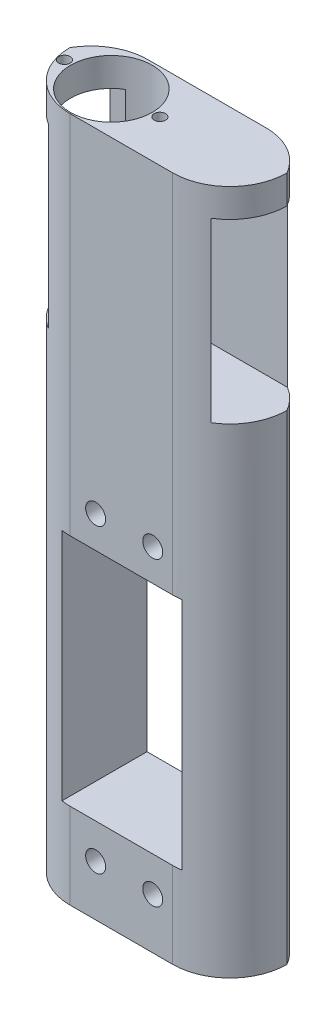
ISO-10303-21;
HEADER;
FILE_DESCRIPTION(('STEP AP214'),'2;1');
FILE_NAME('part.step','',(''),(''),'','','');
FILE_SCHEMA(('AUTOMOTIVE_DESIGN { 1 0 10303 214 1 1 1 1 }'));
ENDSEC;
DATA;
#1=APPLICATION_CONTEXT('core data for automotive mechanical design processes');
#2=APPLICATION_PROTOCOL_DEFINITION('international standard','automotive_design',2000,#1);
#3=PRODUCT_CONTEXT('',#1,'mechanical');
#4=PRODUCT('Part','Part','',(#3));
#5=PRODUCT_RELATED_PRODUCT_CATEGORY('part','',(#4));
#6=PRODUCT_DEFINITION_FORMATION('','',#4);
#7=PRODUCT_DEFINITION_CONTEXT('part definition',#1,'design');
#8=PRODUCT_DEFINITION('design','',#6,#7);
#9=PRODUCT_DEFINITION_SHAPE('','',#8);
#10=(LENGTH_UNIT() NAMED_UNIT(*) SI_UNIT(.MILLI.,.METRE.));
#11=(NAMED_UNIT(*) PLANE_ANGLE_UNIT() SI_UNIT($,.RADIAN.));
#12=(NAMED_UNIT(*) SI_UNIT($,.STERADIAN.) SOLID_ANGLE_UNIT());
#13=UNCERTAINTY_MEASURE_WITH_UNIT(LENGTH_MEASURE(1.E-05),#10,'distance_accuracy_value','');
#14=(GEOMETRIC_REPRESENTATION_CONTEXT(3) GLOBAL_UNCERTAINTY_ASSIGNED_CONTEXT((#13)) GLOBAL_UNIT_ASSIGNED_CONTEXT((#10,
#11,#12)) REPRESENTATION_CONTEXT('',''));
#15=CARTESIAN_POINT('',(0.,0.,0.));
#16=DIRECTION('',(0.,0.,1.));
#17=DIRECTION('',(1.,0.,0.));
#18=AXIS2_PLACEMENT_3D('',#15,#16,#17);
#19=CARTESIAN_POINT('',(0.,0.,0.));
#20=DIRECTION('',(0.,0.,1.));
#21=DIRECTION('',(1.,0.,0.));
#22=AXIS2_PLACEMENT_3D('',#19,#20,#21);
#23=PLANE('',#22);
#24=CARTESIAN_POINT('',(-6.24380165289257,-9.51763056496016,0.));
#25=DIRECTION('',(0.,0.,1.));
#26=DIRECTION('',(1.,0.,0.));
#27=AXIS2_PLACEMENT_3D('',#24,#25,#26);
#28=CIRCLE('',#27,1.75);
#29=CARTESIAN_POINT('',(-4.49380165289257,-9.51763056496016,0.));
#30=VERTEX_POINT('',#29);
#31=EDGE_CURVE('E262',#30,#30,#28,.T.);
#32=ORIENTED_EDGE('',*,*,#31,.T.);
#33=EDGE_LOOP('',(#32));
#34=FACE_BOUND('',#33,.T.);
#35=CARTESIAN_POINT('',(3.75619834710743,-9.51763056496016,0.));
#36=DIRECTION('',(0.,0.,1.));
#37=DIRECTION('',(1.,0.,0.));
#38=AXIS2_PLACEMENT_3D('',#35,#36,#37);
#39=CIRCLE('',#38,1.75);
#40=CARTESIAN_POINT('',(5.50619834710743,-9.51763056496016,0.));
#41=VERTEX_POINT('',#40);
#42=EDGE_CURVE('E254',#41,#41,#39,.T.);
#43=ORIENTED_EDGE('',*,*,#42,.T.);
#44=EDGE_LOOP('',(#43));
#45=FACE_BOUND('',#44,.T.);
#46=DIRECTION('',(-1.,0.,0.));
#47=VECTOR('',#46,1.);
#48=CARTESIAN_POINT('',(-20.7438016528926,48.8925619834711,0.));
#49=LINE('',#48,#47);
#50=CARTESIAN_POINT('',(8.59594430926305,48.8925619834711,0.));
#51=VERTEX_POINT('',#50);
#52=CARTESIAN_POINT('',(-12.0835476150482,48.8925619834711,0.));
#53=VERTEX_POINT('',#52);
#54=EDGE_CURVE('E292',#51,#53,#49,.T.);
#55=ORIENTED_EDGE('',*,*,#54,.F.);
#56=DIRECTION('',(0.,1.,0.));
#57=VECTOR('',#56,1.);
#58=CARTESIAN_POINT('',(8.59594430926305,0.,0.));
#59=LINE('',#58,#57);
#60=CARTESIAN_POINT('',(8.59594430926305,-15.1074380165289,0.));
#61=VERTEX_POINT('',#60);
#62=EDGE_CURVE('E381',#51,#61,#59,.F.);
#63=ORIENTED_EDGE('',*,*,#62,.T.);
#64=DIRECTION('',(1.,0.,0.));
#65=VECTOR('',#64,1.);
#66=CARTESIAN_POINT('',(-12.2438016528926,-15.1074380165289,0.));
#67=LINE('',#66,#65);
#68=CARTESIAN_POINT('',(-12.0835476150482,-15.1074380165289,0.));
#69=VERTEX_POINT('',#68);
#70=EDGE_CURVE('E271',#69,#61,#67,.T.);
#71=ORIENTED_EDGE('',*,*,#70,.F.);
#72=DIRECTION('',(0.,-1.,0.));
#73=VECTOR('',#72,1.);
#74=CARTESIAN_POINT('',(-12.0835476150482,0.,0.));
#75=LINE('',#74,#73);
#76=EDGE_CURVE('E375',#69,#53,#75,.F.);
#77=ORIENTED_EDGE('',*,*,#76,.T.);
#78=EDGE_LOOP('',(#55,#63,#71,#77));
#79=FACE_BOUND('',#78,.T.);
#80=ADVANCED_FACE('F41',(#34,#45,#79),#23,.F.);
#81=CARTESIAN_POINT('',(0.,0.,15.));
#82=DIRECTION('',(0.,0.,1.));
#83=DIRECTION('',(1.,0.,0.));
#84=AXIS2_PLACEMENT_3D('',#81,#82,#83);
#85=PLANE('',#84);
#86=CARTESIAN_POINT('',(3.75619834710744,-62.2155638806435,15.));
#87=DIRECTION('',(0.,0.,1.));
#88=DIRECTION('',(1.,0.,0.));
#89=AXIS2_PLACEMENT_3D('',#86,#87,#88);
#90=CIRCLE('',#89,1.75);
#91=CARTESIAN_POINT('',(5.50619834710744,-62.2155638806435,15.));
#92=VERTEX_POINT('',#91);
#93=EDGE_CURVE('E244',#92,#92,#90,.T.);
#94=ORIENTED_EDGE('',*,*,#93,.F.);
#95=EDGE_LOOP('',(#94));
#96=FACE_BOUND('',#95,.T.);
#97=CARTESIAN_POINT('',(-6.24380165289257,-62.2155638806435,15.));
#98=DIRECTION('',(0.,0.,1.));
#99=DIRECTION('',(1.,0.,0.));
#100=AXIS2_PLACEMENT_3D('',#97,#98,#99);
#101=CIRCLE('',#100,1.75);
#102=CARTESIAN_POINT('',(-4.49380165289256,-62.2155638806435,15.));
#103=VERTEX_POINT('',#102);
#104=EDGE_CURVE('E257',#103,#103,#101,.T.);
#105=ORIENTED_EDGE('',*,*,#104,.F.);
#106=EDGE_LOOP('',(#105));
#107=FACE_BOUND('',#106,.T.);
#108=DIRECTION('',(1.,0.,0.));
#109=VECTOR('',#108,1.);
#110=CARTESIAN_POINT('',(-20.7438016528926,-71.1074380165289,15.));
#111=LINE('',#110,#109);
#112=CARTESIAN_POINT('',(-10.7438016528926,-71.1074380165289,15.));
#113=VERTEX_POINT('',#112);
#114=CARTESIAN_POINT('',(7.25619834710745,-71.1074380165289,15.));
#115=VERTEX_POINT('',#114);
#116=EDGE_CURVE('E288',#113,#115,#111,.T.);
#117=ORIENTED_EDGE('',*,*,#116,.T.);
#118=DIRECTION('',(0.,1.,0.));
#119=VECTOR('',#118,1.);
#120=CARTESIAN_POINT('',(7.25619834710743,48.8925619834711,15.));
#121=LINE('',#120,#119);
#122=CARTESIAN_POINT('',(7.25619834710744,-56.1074380165289,15.));
#123=VERTEX_POINT('',#122);
#124=EDGE_CURVE('E318',#115,#123,#121,.T.);
#125=ORIENTED_EDGE('',*,*,#124,.T.);
#126=DIRECTION('',(1.,0.,0.));
#127=VECTOR('',#126,1.);
#128=CARTESIAN_POINT('',(-12.2438016528926,-56.1074380165289,15.));
#129=LINE('',#128,#127);
#130=CARTESIAN_POINT('',(-10.7438016528926,-56.1074380165289,15.));
#131=VERTEX_POINT('',#130);
#132=EDGE_CURVE('E265',#131,#123,#129,.T.);
#133=ORIENTED_EDGE('',*,*,#132,.F.);
#134=DIRECTION('',(0.,-1.,0.));
#135=VECTOR('',#134,1.);
#136=CARTESIAN_POINT('',(-10.7438016528926,-71.1074380165289,15.));
#137=LINE('',#136,#135);
#138=EDGE_CURVE('E307',#131,#113,#137,.T.);
#139=ORIENTED_EDGE('',*,*,#138,.T.);
#140=EDGE_LOOP('',(#117,#125,#133,#139));
#141=FACE_BOUND('',#140,.T.);
#142=ADVANCED_FACE('F460',(#96,#107,#141),#85,.T.);
#143=CARTESIAN_POINT('',(-20.7438016528926,43.8925619834711,13.5312912499812));
#144=DIRECTION('',(0.,1.,0.));
#145=DIRECTION('',(-1.,0.,0.));
#146=AXIS2_PLACEMENT_3D('',#143,#144,#145);
#147=PLANE('',#146);
#148=CARTESIAN_POINT('',(-2.36469917471287,43.8925619834711,7.62880946549471));
#149=DIRECTION('',(0.,1.,0.));
#150=DIRECTION('',(-1.,0.,0.));
#151=AXIS2_PLACEMENT_3D('',#148,#149,#150);
#152=CIRCLE('',#151,0.999999999999997);
#153=CARTESIAN_POINT('',(-3.36469917471287,43.8925619834711,7.62880946549471));
#154=VERTEX_POINT('',#153);
#155=EDGE_CURVE('E243',#154,#154,#152,.T.);
#156=ORIENTED_EDGE('',*,*,#155,.T.);
#157=EDGE_LOOP('',(#156));
#158=FACE_BOUND('',#157,.T.);
#159=DIRECTION('',(1.,0.,0.));
#160=VECTOR('',#159,1.);
#161=CARTESIAN_POINT('',(-20.7438016528926,43.8925619834711,1.46870875001881));
#162=LINE('',#161,#160);
#163=CARTESIAN_POINT('',(-7.22396094970001,43.8925619834711,1.4687087500188));
#164=VERTEX_POINT('',#163);
#165=CARTESIAN_POINT('',(13.8129424507228,43.8925619834711,1.46870875001881));
#166=VERTEX_POINT('',#165);
#167=EDGE_CURVE('E237',#164,#166,#162,.T.);
#168=ORIENTED_EDGE('',*,*,#167,.T.);
#169=CARTESIAN_POINT('',(8.59594430926305,43.8925619834711,10.));
#170=DIRECTION('',(0.,1.,0.));
#171=DIRECTION('',(-1.,0.,0.));
#172=AXIS2_PLACEMENT_3D('',#169,#170,#171);
#173=CIRCLE('',#172,10.);
#174=CARTESIAN_POINT('',(17.2561983471074,43.8925619834711,5.));
#175=VERTEX_POINT('',#174);
#176=EDGE_CURVE('E404',#166,#175,#173,.F.);
#177=ORIENTED_EDGE('',*,*,#176,.T.);
#178=CARTESIAN_POINT('',(7.25619834710743,43.8925619834711,5.));
#179=DIRECTION('',(0.,1.,0.));
#180=DIRECTION('',(-1.,0.,0.));
#181=AXIS2_PLACEMENT_3D('',#178,#179,#180);
#182=CIRCLE('',#181,10.);
#183=CARTESIAN_POINT('',(12.4731964885672,43.8925619834711,13.5312912499812));
#184=VERTEX_POINT('',#183);
#185=EDGE_CURVE('E345',#175,#184,#182,.F.);
#186=ORIENTED_EDGE('',*,*,#185,.T.);
#187=DIRECTION('',(1.,0.,0.));
#188=VECTOR('',#187,1.);
#189=CARTESIAN_POINT('',(-20.7438016528926,43.8925619834711,13.5312912499812));
#190=LINE('',#189,#188);
#191=CARTESIAN_POINT('',(-6.81963744073625,43.8925619834711,13.5312912499812));
#192=VERTEX_POINT('',#191);
#193=EDGE_CURVE('E234',#192,#184,#190,.T.);
#194=ORIENTED_EDGE('',*,*,#193,.F.);
#195=CARTESIAN_POINT('',(-10.8646991747129,43.8925619834711,7.62880946549471));
#196=DIRECTION('',(0.,1.,0.));
#197=DIRECTION('',(-1.,0.,0.));
#198=AXIS2_PLACEMENT_3D('',#195,#196,#197);
#199=CIRCLE('',#198,7.15554439912691);
#200=EDGE_CURVE('E210',#192,#164,#199,.T.);
#201=ORIENTED_EDGE('',*,*,#200,.T.);
#202=EDGE_LOOP('',(#168,#177,#186,#194,#201));
#203=FACE_BOUND('',#202,.T.);
#204=ADVANCED_FACE('F490',(#158,#203),#147,.F.);
#205=CARTESIAN_POINT('',(-20.7438016528926,-71.1074380165289,15.));
#206=DIRECTION('',(0.,1.,0.));
#207=DIRECTION('',(-1.,0.,0.));
#208=AXIS2_PLACEMENT_3D('',#205,#206,#207);
#209=PLANE('',#208);
#210=DIRECTION('',(1.,0.,0.));
#211=VECTOR('',#210,1.);
#212=CARTESIAN_POINT('',(-20.7438016528926,-71.1074380165289,0.));
#213=LINE('',#212,#211);
#214=CARTESIAN_POINT('',(-12.0835476150482,-71.1074380165289,0.));
#215=VERTEX_POINT('',#214);
#216=CARTESIAN_POINT('',(8.59594430926306,-71.1074380165289,0.));
#217=VERTEX_POINT('',#216);
#218=EDGE_CURVE('E282',#215,#217,#213,.T.);
#219=ORIENTED_EDGE('',*,*,#218,.T.);
#220=CARTESIAN_POINT('',(8.59594430926306,-71.1074380165289,10.));
#221=DIRECTION('',(0.,1.,0.));
#222=DIRECTION('',(-1.,0.,0.));
#223=AXIS2_PLACEMENT_3D('',#220,#221,#222);
#224=CIRCLE('',#223,10.);
#225=CARTESIAN_POINT('',(17.2561983471074,-71.1074380165289,5.));
#226=VERTEX_POINT('',#225);
#227=EDGE_CURVE('E395',#217,#226,#224,.F.);
#228=ORIENTED_EDGE('',*,*,#227,.T.);
#229=CARTESIAN_POINT('',(7.25619834710745,-71.1074380165289,5.));
#230=DIRECTION('',(0.,1.,0.));
#231=DIRECTION('',(-1.,0.,0.));
#232=AXIS2_PLACEMENT_3D('',#229,#230,#231);
#233=CIRCLE('',#232,10.);
#234=EDGE_CURVE('E358',#226,#115,#233,.F.);
#235=ORIENTED_EDGE('',*,*,#234,.T.);
#236=ORIENTED_EDGE('',*,*,#116,.F.);
#237=CARTESIAN_POINT('',(-10.7438016528926,-71.1074380165289,5.));
#238=DIRECTION('',(0.,1.,0.));
#239=DIRECTION('',(-1.,0.,0.));
#240=AXIS2_PLACEMENT_3D('',#237,#238,#239);
#241=CIRCLE('',#240,10.);
#242=CARTESIAN_POINT('',(-20.7438016528926,-71.1074380165289,5.));
#243=VERTEX_POINT('',#242);
#244=EDGE_CURVE('E355',#113,#243,#241,.F.);
#245=ORIENTED_EDGE('',*,*,#244,.T.);
#246=CARTESIAN_POINT('',(-12.0835476150482,-71.1074380165289,10.));
#247=DIRECTION('',(0.,1.,0.));
#248=DIRECTION('',(-1.,0.,0.));
#249=AXIS2_PLACEMENT_3D('',#246,#247,#248);
#250=CIRCLE('',#249,10.);
#251=EDGE_CURVE('E393',#243,#215,#250,.F.);
#252=ORIENTED_EDGE('',*,*,#251,.T.);
#253=EDGE_LOOP('',(#219,#228,#235,#236,#245,#252));
#254=FACE_BOUND('',#253,.T.);
#255=ADVANCED_FACE('F463',(#254),#209,.F.);
#256=CARTESIAN_POINT('',(-20.7438016528926,48.8925619834711,15.));
#257=DIRECTION('',(0.,-1.,0.));
#258=DIRECTION('',(0.,0.,-1.));
#259=AXIS2_PLACEMENT_3D('',#256,#257,#258);
#260=PLANE('',#259);
#261=CARTESIAN_POINT('',(-2.36469917471287,48.8925619834711,7.62880946549471));
#262=DIRECTION('',(0.,1.,0.));
#263=DIRECTION('',(0.,0.,1.));
#264=AXIS2_PLACEMENT_3D('',#261,#262,#263);
#265=CIRCLE('',#264,0.999999999999997);
#266=CARTESIAN_POINT('',(-2.36469917471287,48.8925619834711,8.6288094654947));
#267=VERTEX_POINT('',#266);
#268=EDGE_CURVE('E803',#267,#267,#265,.T.);
#269=ORIENTED_EDGE('',*,*,#268,.F.);
#270=EDGE_LOOP('',(#269));
#271=FACE_BOUND('',#270,.T.);
#272=CARTESIAN_POINT('',(-19.3646991747129,48.8925619834711,7.34037533265232));
#273=DIRECTION('',(0.,1.,0.));
#274=DIRECTION('',(0.,0.,1.));
#275=AXIS2_PLACEMENT_3D('',#272,#273,#274);
#276=CIRCLE('',#275,0.999999999999998);
#277=CARTESIAN_POINT('',(-19.3646991747129,48.8925619834711,8.34037533265232));
#278=VERTEX_POINT('',#277);
#279=EDGE_CURVE('E801',#278,#278,#276,.T.);
#280=ORIENTED_EDGE('',*,*,#279,.F.);
#281=EDGE_LOOP('',(#280));
#282=FACE_BOUND('',#281,.T.);
#283=CARTESIAN_POINT('',(-10.8646991747129,48.8925619834711,7.62880946549471));
#284=DIRECTION('',(0.,1.,0.));
#285=DIRECTION('',(0.,0.,1.));
#286=AXIS2_PLACEMENT_3D('',#283,#284,#285);
#287=CIRCLE('',#286,7.15554439912691);
#288=CARTESIAN_POINT('',(-10.8646991747129,48.8925619834711,14.7843538646216));
#289=VERTEX_POINT('',#288);
#290=EDGE_CURVE('E221',#289,#289,#287,.T.);
#291=ORIENTED_EDGE('',*,*,#290,.F.);
#292=EDGE_LOOP('',(#291));
#293=FACE_BOUND('',#292,.T.);
#294=CARTESIAN_POINT('',(7.25619834710743,48.8925619834711,5.));
#295=DIRECTION('',(0.,-1.,0.));
#296=DIRECTION('',(0.,0.,-1.));
#297=AXIS2_PLACEMENT_3D('',#294,#295,#296);
#298=CIRCLE('',#297,10.);
#299=CARTESIAN_POINT('',(7.25619834710743,48.8925619834711,15.));
#300=VERTEX_POINT('',#299);
#301=CARTESIAN_POINT('',(17.2561983471074,48.8925619834711,5.));
#302=VERTEX_POINT('',#301);
#303=EDGE_CURVE('E336',#300,#302,#298,.F.);
#304=ORIENTED_EDGE('',*,*,#303,.T.);
#305=CARTESIAN_POINT('',(8.59594430926305,48.8925619834711,10.));
#306=DIRECTION('',(0.,-1.,0.));
#307=DIRECTION('',(0.,0.,-1.));
#308=AXIS2_PLACEMENT_3D('',#305,#306,#307);
#309=CIRCLE('',#308,10.);
#310=EDGE_CURVE('E373',#302,#51,#309,.F.);
#311=ORIENTED_EDGE('',*,*,#310,.T.);
#312=ORIENTED_EDGE('',*,*,#54,.T.);
#313=CARTESIAN_POINT('',(-12.0835476150482,48.8925619834711,10.));
#314=DIRECTION('',(0.,-1.,0.));
#315=DIRECTION('',(0.,0.,-1.));
#316=AXIS2_PLACEMENT_3D('',#313,#314,#315);
#317=CIRCLE('',#316,10.);
#318=CARTESIAN_POINT('',(-20.7438016528926,48.8925619834711,5.));
#319=VERTEX_POINT('',#318);
#320=EDGE_CURVE('E371',#53,#319,#317,.F.);
#321=ORIENTED_EDGE('',*,*,#320,.T.);
#322=CARTESIAN_POINT('',(-10.7438016528926,48.8925619834711,5.));
#323=DIRECTION('',(0.,-1.,0.));
#324=DIRECTION('',(0.,0.,-1.));
#325=AXIS2_PLACEMENT_3D('',#322,#323,#324);
#326=CIRCLE('',#325,10.);
#327=CARTESIAN_POINT('',(-10.7438016528926,48.8925619834711,15.));
#328=VERTEX_POINT('',#327);
#329=EDGE_CURVE('E334',#319,#328,#326,.F.);
#330=ORIENTED_EDGE('',*,*,#329,.T.);
#331=DIRECTION('',(-1.,0.,0.));
#332=VECTOR('',#331,1.);
#333=CARTESIAN_POINT('',(-20.7438016528926,48.8925619834711,15.));
#334=LINE('',#333,#332);
#335=EDGE_CURVE('E291',#300,#328,#334,.T.);
#336=ORIENTED_EDGE('',*,*,#335,.F.);
#337=EDGE_LOOP('',(#304,#311,#312,#321,#330,#336));
#338=FACE_BOUND('',#337,.T.);
#339=ADVANCED_FACE('F424',(#271,#282,#293,#338),#260,.F.);
#340=CARTESIAN_POINT('',(3.75619834710743,-9.51763056496016,15.));
#341=DIRECTION('',(0.,0.,1.));
#342=DIRECTION('',(1.,0.,0.));
#343=AXIS2_PLACEMENT_3D('',#340,#341,#342);
#344=CIRCLE('',#343,1.75);
#345=CARTESIAN_POINT('',(5.50619834710743,-9.51763056496016,15.));
#346=VERTEX_POINT('',#345);
#347=EDGE_CURVE('E250',#346,#346,#344,.T.);
#348=ORIENTED_EDGE('',*,*,#347,.F.);
#349=EDGE_LOOP('',(#348));
#350=FACE_BOUND('',#349,.T.);
#351=CARTESIAN_POINT('',(-6.24380165289257,-9.51763056496016,15.));
#352=DIRECTION('',(0.,0.,1.));
#353=DIRECTION('',(1.,0.,0.));
#354=AXIS2_PLACEMENT_3D('',#351,#352,#353);
#355=CIRCLE('',#354,1.75);
#356=CARTESIAN_POINT('',(-4.49380165289257,-9.51763056496016,15.));
#357=VERTEX_POINT('',#356);
#358=EDGE_CURVE('E253',#357,#357,#355,.T.);
#359=ORIENTED_EDGE('',*,*,#358,.F.);
#360=EDGE_LOOP('',(#359));
#361=FACE_BOUND('',#360,.T.);
#362=DIRECTION('',(1.,0.,0.));
#363=VECTOR('',#362,1.);
#364=CARTESIAN_POINT('',(-12.2438016528926,-15.1074380165289,15.));
#365=LINE('',#364,#363);
#366=CARTESIAN_POINT('',(-10.7438016528926,-15.1074380165289,15.));
#367=VERTEX_POINT('',#366);
#368=CARTESIAN_POINT('',(7.25619834710744,-15.1074380165289,15.));
#369=VERTEX_POINT('',#368);
#370=EDGE_CURVE('E272',#367,#369,#365,.T.);
#371=ORIENTED_EDGE('',*,*,#370,.T.);
#372=DIRECTION('',(0.,1.,0.));
#373=VECTOR('',#372,1.);
#374=CARTESIAN_POINT('',(7.25619834710743,48.8925619834711,15.));
#375=LINE('',#374,#373);
#376=EDGE_CURVE('E316',#369,#300,#375,.T.);
#377=ORIENTED_EDGE('',*,*,#376,.T.);
#378=ORIENTED_EDGE('',*,*,#335,.T.);
#379=DIRECTION('',(0.,-1.,0.));
#380=VECTOR('',#379,1.);
#381=CARTESIAN_POINT('',(-10.7438016528926,-71.1074380165289,15.));
#382=LINE('',#381,#380);
#383=EDGE_CURVE('E313',#328,#367,#382,.T.);
#384=ORIENTED_EDGE('',*,*,#383,.T.);
#385=EDGE_LOOP('',(#371,#377,#378,#384));
#386=FACE_BOUND('',#385,.T.);
#387=ADVANCED_FACE('F494',(#350,#361,#386),#85,.T.);
#388=CARTESIAN_POINT('',(-6.24380165289257,-62.2155638806435,0.));
#389=DIRECTION('',(0.,0.,1.));
#390=DIRECTION('',(1.,0.,0.));
#391=AXIS2_PLACEMENT_3D('',#388,#389,#390);
#392=CIRCLE('',#391,1.75);
#393=CARTESIAN_POINT('',(-4.49380165289256,-62.2155638806435,0.));
#394=VERTEX_POINT('',#393);
#395=EDGE_CURVE('E247',#394,#394,#392,.T.);
#396=ORIENTED_EDGE('',*,*,#395,.T.);
#397=EDGE_LOOP('',(#396));
#398=FACE_BOUND('',#397,.T.);
#399=CARTESIAN_POINT('',(3.75619834710744,-62.2155638806435,0.));
#400=DIRECTION('',(0.,0.,1.));
#401=DIRECTION('',(1.,0.,0.));
#402=AXIS2_PLACEMENT_3D('',#399,#400,#401);
#403=CIRCLE('',#402,1.75);
#404=CARTESIAN_POINT('',(5.50619834710744,-62.2155638806435,0.));
#405=VERTEX_POINT('',#404);
#406=EDGE_CURVE('E233',#405,#405,#403,.T.);
#407=ORIENTED_EDGE('',*,*,#406,.T.);
#408=EDGE_LOOP('',(#407));
#409=FACE_BOUND('',#408,.T.);
#410=DIRECTION('',(1.,0.,0.));
#411=VECTOR('',#410,1.);
#412=CARTESIAN_POINT('',(-12.2438016528926,-56.1074380165289,0.));
#413=LINE('',#412,#411);
#414=CARTESIAN_POINT('',(-12.0835476150482,-56.1074380165289,0.));
#415=VERTEX_POINT('',#414);
#416=CARTESIAN_POINT('',(8.59594430926305,-56.1074380165289,0.));
#417=VERTEX_POINT('',#416);
#418=EDGE_CURVE('E268',#415,#417,#413,.T.);
#419=ORIENTED_EDGE('',*,*,#418,.T.);
#420=DIRECTION('',(0.,1.,0.));
#421=VECTOR('',#420,1.);
#422=CARTESIAN_POINT('',(8.59594430926305,0.,0.));
#423=LINE('',#422,#421);
#424=EDGE_CURVE('E379',#417,#217,#423,.F.);
#425=ORIENTED_EDGE('',*,*,#424,.T.);
#426=ORIENTED_EDGE('',*,*,#218,.F.);
#427=DIRECTION('',(0.,-1.,0.));
#428=VECTOR('',#427,1.);
#429=CARTESIAN_POINT('',(-12.0835476150482,0.,0.));
#430=LINE('',#429,#428);
#431=EDGE_CURVE('E377',#215,#415,#430,.F.);
#432=ORIENTED_EDGE('',*,*,#431,.T.);
#433=EDGE_LOOP('',(#419,#425,#426,#432));
#434=FACE_BOUND('',#433,.T.);
#435=ADVANCED_FACE('F447',(#398,#409,#434),#23,.F.);
#436=CARTESIAN_POINT('',(-12.2438016528926,-56.1074380165289,0.));
#437=DIRECTION('',(0.,-1.,0.));
#438=DIRECTION('',(1.,0.,0.));
#439=AXIS2_PLACEMENT_3D('',#436,#437,#438);
#440=PLANE('',#439);
#441=DIRECTION('',(0.,0.,1.));
#442=VECTOR('',#441,1.);
#443=CARTESIAN_POINT('',(8.75619834710744,-56.1074380165289,0.));
#444=LINE('',#443,#442);
#445=CARTESIAN_POINT('',(8.75619834710744,-56.1074380165289,0.00128415028436898));
#446=VERTEX_POINT('',#445);
#447=CARTESIAN_POINT('',(8.75619834710744,-56.1074380165289,14.8868599666426));
#448=VERTEX_POINT('',#447);
#449=EDGE_CURVE('E275',#446,#448,#444,.T.);
#450=ORIENTED_EDGE('',*,*,#449,.F.);
#451=CARTESIAN_POINT('',(8.59594430926306,-56.1074380165289,10.));
#452=DIRECTION('',(0.,-1.,0.));
#453=DIRECTION('',(1.,0.,0.));
#454=AXIS2_PLACEMENT_3D('',#451,#452,#453);
#455=CIRCLE('',#454,10.);
#456=EDGE_CURVE('E391',#446,#417,#455,.F.);
#457=ORIENTED_EDGE('',*,*,#456,.T.);
#458=ORIENTED_EDGE('',*,*,#418,.F.);
#459=CARTESIAN_POINT('',(-12.0835476150482,-56.1074380165289,10.));
#460=DIRECTION('',(0.,-1.,0.));
#461=DIRECTION('',(1.,0.,0.));
#462=AXIS2_PLACEMENT_3D('',#459,#460,#461);
#463=CIRCLE('',#462,10.);
#464=CARTESIAN_POINT('',(-12.2438016528926,-56.1074380165289,0.00128415028436898));
#465=VERTEX_POINT('',#464);
#466=EDGE_CURVE('E389',#415,#465,#463,.F.);
#467=ORIENTED_EDGE('',*,*,#466,.T.);
#468=DIRECTION('',(0.,0.,1.));
#469=VECTOR('',#468,1.);
#470=CARTESIAN_POINT('',(-12.2438016528926,-56.1074380165289,0.));
#471=LINE('',#470,#469);
#472=CARTESIAN_POINT('',(-12.2438016528926,-56.1074380165289,14.8868599666426));
#473=VERTEX_POINT('',#472);
#474=EDGE_CURVE('E280',#465,#473,#471,.T.);
#475=ORIENTED_EDGE('',*,*,#474,.T.);
#476=CARTESIAN_POINT('',(-10.7438016528926,-56.1074380165289,5.));
#477=DIRECTION('',(0.,-1.,0.));
#478=DIRECTION('',(1.,0.,0.));
#479=AXIS2_PLACEMENT_3D('',#476,#477,#478);
#480=CIRCLE('',#479,10.);
#481=EDGE_CURVE('E321',#473,#131,#480,.F.);
#482=ORIENTED_EDGE('',*,*,#481,.T.);
#483=ORIENTED_EDGE('',*,*,#132,.T.);
#484=CARTESIAN_POINT('',(7.25619834710745,-56.1074380165289,5.));
#485=DIRECTION('',(0.,-1.,0.));
#486=DIRECTION('',(1.,0.,0.));
#487=AXIS2_PLACEMENT_3D('',#484,#485,#486);
#488=CIRCLE('',#487,10.);
#489=EDGE_CURVE('E323',#123,#448,#488,.F.);
#490=ORIENTED_EDGE('',*,*,#489,.T.);
#491=EDGE_LOOP('',(#450,#457,#458,#467,#475,#482,#483,#490));
#492=FACE_BOUND('',#491,.T.);
#493=ADVANCED_FACE('F445',(#492),#440,.F.);
#494=CARTESIAN_POINT('',(-12.2438016528926,-15.1074380165289,0.));
#495=DIRECTION('',(-1.,0.,0.));
#496=DIRECTION('',(0.,-1.,0.));
#497=AXIS2_PLACEMENT_3D('',#494,#495,#496);
#498=PLANE('',#497);
#499=ORIENTED_EDGE('',*,*,#474,.F.);
#500=DIRECTION('',(0.,-1.,0.));
#501=VECTOR('',#500,1.);
#502=CARTESIAN_POINT('',(-12.2438016528926,-56.1074380165289,0.00128415028436898));
#503=LINE('',#502,#501);
#504=CARTESIAN_POINT('',(-12.2438016528926,-15.1074380165289,0.00128415028436898));
#505=VERTEX_POINT('',#504);
#506=EDGE_CURVE('E49',#465,#505,#503,.F.);
#507=ORIENTED_EDGE('',*,*,#506,.T.);
#508=DIRECTION('',(0.,0.,1.));
#509=VECTOR('',#508,1.);
#510=CARTESIAN_POINT('',(-12.2438016528926,-15.1074380165289,0.));
#511=LINE('',#510,#509);
#512=CARTESIAN_POINT('',(-12.2438016528926,-15.1074380165289,14.8868599666426));
#513=VERTEX_POINT('',#512);
#514=EDGE_CURVE('E283',#505,#513,#511,.T.);
#515=ORIENTED_EDGE('',*,*,#514,.T.);
#516=DIRECTION('',(0.,1.,0.));
#517=VECTOR('',#516,1.);
#518=CARTESIAN_POINT('',(-12.2438016528926,-15.1074380165289,14.8868599666426));
#519=LINE('',#518,#517);
#520=EDGE_CURVE('E360',#513,#473,#519,.F.);
#521=ORIENTED_EDGE('',*,*,#520,.T.);
#522=EDGE_LOOP('',(#499,#507,#515,#521));
#523=FACE_BOUND('',#522,.T.);
#524=ADVANCED_FACE('F409',(#523),#498,.F.);
#525=CARTESIAN_POINT('',(-12.2438016528926,-15.1074380165289,0.));
#526=DIRECTION('',(0.,-1.,0.));
#527=DIRECTION('',(1.,0.,0.));
#528=AXIS2_PLACEMENT_3D('',#525,#526,#527);
#529=PLANE('',#528);
#530=ORIENTED_EDGE('',*,*,#70,.T.);
#531=CARTESIAN_POINT('',(8.59594430926305,-15.1074380165289,10.));
#532=DIRECTION('',(0.,-1.,0.));
#533=DIRECTION('',(1.,0.,0.));
#534=AXIS2_PLACEMENT_3D('',#531,#532,#533);
#535=CIRCLE('',#534,10.);
#536=CARTESIAN_POINT('',(8.75619834710743,-15.1074380165289,0.00128415028436898));
#537=VERTEX_POINT('',#536);
#538=EDGE_CURVE('E385',#61,#537,#535,.T.);
#539=ORIENTED_EDGE('',*,*,#538,.T.);
#540=DIRECTION('',(0.,0.,1.));
#541=VECTOR('',#540,1.);
#542=CARTESIAN_POINT('',(8.75619834710743,-15.1074380165289,0.));
#543=LINE('',#542,#541);
#544=CARTESIAN_POINT('',(8.75619834710743,-15.1074380165289,14.8868599666426));
#545=VERTEX_POINT('',#544);
#546=EDGE_CURVE('E285',#537,#545,#543,.T.);
#547=ORIENTED_EDGE('',*,*,#546,.T.);
#548=CARTESIAN_POINT('',(7.25619834710744,-15.1074380165289,5.));
#549=DIRECTION('',(0.,-1.,0.));
#550=DIRECTION('',(1.,0.,0.));
#551=AXIS2_PLACEMENT_3D('',#548,#549,#550);
#552=CIRCLE('',#551,10.);
#553=EDGE_CURVE('E332',#545,#369,#552,.T.);
#554=ORIENTED_EDGE('',*,*,#553,.T.);
#555=ORIENTED_EDGE('',*,*,#370,.F.);
#556=CARTESIAN_POINT('',(-10.7438016528926,-15.1074380165289,5.));
#557=DIRECTION('',(0.,-1.,0.));
#558=DIRECTION('',(1.,0.,0.));
#559=AXIS2_PLACEMENT_3D('',#556,#557,#558);
#560=CIRCLE('',#559,10.);
#561=EDGE_CURVE('E329',#367,#513,#560,.T.);
#562=ORIENTED_EDGE('',*,*,#561,.T.);
#563=ORIENTED_EDGE('',*,*,#514,.F.);
#564=CARTESIAN_POINT('',(-12.0835476150482,-15.1074380165289,10.));
#565=DIRECTION('',(0.,-1.,0.));
#566=DIRECTION('',(1.,0.,0.));
#567=AXIS2_PLACEMENT_3D('',#564,#565,#566);
#568=CIRCLE('',#567,10.);
#569=EDGE_CURVE('E383',#505,#69,#568,.T.);
#570=ORIENTED_EDGE('',*,*,#569,.T.);
#571=EDGE_LOOP('',(#530,#539,#547,#554,#555,#562,#563,#570));
#572=FACE_BOUND('',#571,.T.);
#573=ADVANCED_FACE('F414',(#572),#529,.T.);
#574=CARTESIAN_POINT('',(8.75619834710743,-15.1074380165289,0.));
#575=DIRECTION('',(-1.,0.,0.));
#576=DIRECTION('',(0.,-1.,0.));
#577=AXIS2_PLACEMENT_3D('',#574,#575,#576);
#578=PLANE('',#577);
#579=ORIENTED_EDGE('',*,*,#546,.F.);
#580=DIRECTION('',(0.,1.,0.));
#581=VECTOR('',#580,1.);
#582=CARTESIAN_POINT('',(8.75619834710743,-15.1074380165289,0.00128415028436898));
#583=LINE('',#582,#581);
#584=EDGE_CURVE('E387',#537,#446,#583,.F.);
#585=ORIENTED_EDGE('',*,*,#584,.T.);
#586=ORIENTED_EDGE('',*,*,#449,.T.);
#587=DIRECTION('',(0.,-1.,0.));
#588=VECTOR('',#587,1.);
#589=CARTESIAN_POINT('',(8.75619834710744,-56.1074380165289,14.8868599666426));
#590=LINE('',#589,#588);
#591=EDGE_CURVE('E326',#448,#545,#590,.F.);
#592=ORIENTED_EDGE('',*,*,#591,.T.);
#593=EDGE_LOOP('',(#579,#585,#586,#592));
#594=FACE_BOUND('',#593,.T.);
#595=ADVANCED_FACE('F436',(#594),#578,.T.);
#596=CARTESIAN_POINT('',(-6.24380165289257,-9.51763056496016,0.));
#597=DIRECTION('',(0.,0.,1.));
#598=DIRECTION('',(1.,0.,0.));
#599=AXIS2_PLACEMENT_3D('',#596,#597,#598);
#600=CYLINDRICAL_SURFACE('',#599,1.75);
#601=ORIENTED_EDGE('',*,*,#31,.F.);
#602=EDGE_LOOP('',(#601));
#603=FACE_BOUND('',#602,.T.);
#604=ORIENTED_EDGE('',*,*,#358,.T.);
#605=EDGE_LOOP('',(#604));
#606=FACE_BOUND('',#605,.T.);
#607=ADVANCED_FACE('F594',(#603,#606),#600,.F.);
#608=CARTESIAN_POINT('',(3.75619834710744,-62.2155638806435,0.));
#609=DIRECTION('',(0.,0.,1.));
#610=DIRECTION('',(1.,0.,0.));
#611=AXIS2_PLACEMENT_3D('',#608,#609,#610);
#612=CYLINDRICAL_SURFACE('',#611,1.75);
#613=ORIENTED_EDGE('',*,*,#406,.F.);
#614=EDGE_LOOP('',(#613));
#615=FACE_BOUND('',#614,.T.);
#616=ORIENTED_EDGE('',*,*,#93,.T.);
#617=EDGE_LOOP('',(#616));
#618=FACE_BOUND('',#617,.T.);
#619=ADVANCED_FACE('F738',(#615,#618),#612,.F.);
#620=CARTESIAN_POINT('',(-6.24380165289257,-62.2155638806435,0.));
#621=DIRECTION('',(0.,0.,1.));
#622=DIRECTION('',(1.,0.,0.));
#623=AXIS2_PLACEMENT_3D('',#620,#621,#622);
#624=CYLINDRICAL_SURFACE('',#623,1.75);
#625=ORIENTED_EDGE('',*,*,#395,.F.);
#626=EDGE_LOOP('',(#625));
#627=FACE_BOUND('',#626,.T.);
#628=ORIENTED_EDGE('',*,*,#104,.T.);
#629=EDGE_LOOP('',(#628));
#630=FACE_BOUND('',#629,.T.);
#631=ADVANCED_FACE('F727',(#627,#630),#624,.F.);
#632=CARTESIAN_POINT('',(3.75619834710743,-9.51763056496016,0.));
#633=DIRECTION('',(0.,0.,1.));
#634=DIRECTION('',(1.,0.,0.));
#635=AXIS2_PLACEMENT_3D('',#632,#633,#634);
#636=CYLINDRICAL_SURFACE('',#635,1.75);
#637=ORIENTED_EDGE('',*,*,#42,.F.);
#638=EDGE_LOOP('',(#637));
#639=FACE_BOUND('',#638,.T.);
#640=ORIENTED_EDGE('',*,*,#347,.T.);
#641=EDGE_LOOP('',(#640));
#642=FACE_BOUND('',#641,.T.);
#643=ADVANCED_FACE('F662',(#639,#642),#636,.F.);
#644=CARTESIAN_POINT('',(-20.7438016528926,43.8925619834711,13.5312912499812));
#645=DIRECTION('',(0.,0.,1.));
#646=DIRECTION('',(0.,-1.,0.));
#647=AXIS2_PLACEMENT_3D('',#644,#645,#646);
#648=PLANE('',#647);
#649=ORIENTED_EDGE('',*,*,#193,.T.);
#650=DIRECTION('',(0.,-1.,0.));
#651=VECTOR('',#650,1.);
#652=CARTESIAN_POINT('',(12.4731964885672,43.8925619834711,13.5312912499812));
#653=LINE('',#652,#651);
#654=CARTESIAN_POINT('',(12.4731964885672,12.8925619834711,13.5312912499812));
#655=VERTEX_POINT('',#654);
#656=EDGE_CURVE('E349',#184,#655,#653,.T.);
#657=ORIENTED_EDGE('',*,*,#656,.T.);
#658=DIRECTION('',(1.,0.,0.));
#659=VECTOR('',#658,1.);
#660=CARTESIAN_POINT('',(-20.7438016528926,12.8925619834711,13.5312912499812));
#661=LINE('',#660,#659);
#662=CARTESIAN_POINT('',(-15.9607997943523,12.8925619834711,13.5312912499812));
#663=VERTEX_POINT('',#662);
#664=EDGE_CURVE('E240',#663,#655,#661,.T.);
#665=ORIENTED_EDGE('',*,*,#664,.F.);
#666=DIRECTION('',(0.,1.,0.));
#667=VECTOR('',#666,1.);
#668=CARTESIAN_POINT('',(-15.9607997943523,12.8925619834711,13.5312912499812));
#669=LINE('',#668,#667);
#670=CARTESIAN_POINT('',(-15.9607997943523,43.8925619834711,13.5312912499812));
#671=VERTEX_POINT('',#670);
#672=EDGE_CURVE('E347',#663,#671,#669,.T.);
#673=ORIENTED_EDGE('',*,*,#672,.T.);
#674=CARTESIAN_POINT('',(-14.9097609086895,43.8925619834711,13.5312912499812));
#675=VERTEX_POINT('',#674);
#676=EDGE_CURVE('E231',#671,#675,#190,.T.);
#677=ORIENTED_EDGE('',*,*,#676,.T.);
#678=DIRECTION('',(0.,1.,0.));
#679=VECTOR('',#678,1.);
#680=CARTESIAN_POINT('',(-14.9097609086895,38.8925619834711,13.5312912499812));
#681=LINE('',#680,#679);
#682=CARTESIAN_POINT('',(-14.9097609086895,38.8925619834711,13.5312912499812));
#683=VERTEX_POINT('',#682);
#684=EDGE_CURVE('E224',#675,#683,#681,.F.);
#685=ORIENTED_EDGE('',*,*,#684,.T.);
#686=DIRECTION('',(-1.,0.,0.));
#687=VECTOR('',#686,1.);
#688=CARTESIAN_POINT('',(-20.7438016528926,38.8925619834711,13.5312912499812));
#689=LINE('',#688,#687);
#690=CARTESIAN_POINT('',(-6.81963744073625,38.8925619834711,13.5312912499812));
#691=VERTEX_POINT('',#690);
#692=EDGE_CURVE('E219',#691,#683,#689,.T.);
#693=ORIENTED_EDGE('',*,*,#692,.F.);
#694=DIRECTION('',(0.,1.,0.));
#695=VECTOR('',#694,1.);
#696=CARTESIAN_POINT('',(-6.81963744073625,38.8925619834711,13.5312912499812));
#697=LINE('',#696,#695);
#698=EDGE_CURVE('E202',#691,#192,#697,.T.);
#699=ORIENTED_EDGE('',*,*,#698,.T.);
#700=EDGE_LOOP('',(#649,#657,#665,#673,#677,#685,#693,#699));
#701=FACE_BOUND('',#700,.T.);
#702=ADVANCED_FACE('F223',(#701),#648,.F.);
#703=CARTESIAN_POINT('',(-19.3646991747129,43.8925619834711,7.34037533265232));
#704=DIRECTION('',(0.,1.,0.));
#705=DIRECTION('',(-1.,0.,0.));
#706=AXIS2_PLACEMENT_3D('',#703,#704,#705);
#707=CIRCLE('',#706,0.999999999999998);
#708=CARTESIAN_POINT('',(-20.3646991747129,43.8925619834711,7.34037533265232));
#709=VERTEX_POINT('',#708);
#710=EDGE_CURVE('E230',#709,#709,#707,.T.);
#711=ORIENTED_EDGE('',*,*,#710,.T.);
#712=EDGE_LOOP('',(#711));
#713=FACE_BOUND('',#712,.T.);
#714=CARTESIAN_POINT('',(-10.7438016528926,43.8925619834711,5.));
#715=DIRECTION('',(0.,1.,0.));
#716=DIRECTION('',(-1.,0.,0.));
#717=AXIS2_PLACEMENT_3D('',#714,#715,#716);
#718=CIRCLE('',#717,10.);
#719=CARTESIAN_POINT('',(-20.7438016528926,43.8925619834711,5.));
#720=VERTEX_POINT('',#719);
#721=EDGE_CURVE('E369',#671,#720,#718,.F.);
#722=ORIENTED_EDGE('',*,*,#721,.T.);
#723=CARTESIAN_POINT('',(-12.0835476150482,43.8925619834711,10.));
#724=DIRECTION('',(0.,1.,0.));
#725=DIRECTION('',(-1.,0.,0.));
#726=AXIS2_PLACEMENT_3D('',#723,#724,#725);
#727=CIRCLE('',#726,10.);
#728=CARTESIAN_POINT('',(-17.3005457565079,43.8925619834711,1.46870875001881));
#729=VERTEX_POINT('',#728);
#730=EDGE_CURVE('E11',#720,#729,#727,.F.);
#731=ORIENTED_EDGE('',*,*,#730,.T.);
#732=CARTESIAN_POINT('',(-14.5054373997257,43.8925619834711,1.4687087500188));
#733=VERTEX_POINT('',#732);
#734=EDGE_CURVE('E235',#729,#733,#162,.T.);
#735=ORIENTED_EDGE('',*,*,#734,.T.);
#736=EDGE_CURVE('E215',#733,#675,#199,.T.);
#737=ORIENTED_EDGE('',*,*,#736,.T.);
#738=ORIENTED_EDGE('',*,*,#676,.F.);
#739=EDGE_LOOP('',(#722,#731,#735,#737,#738));
#740=FACE_BOUND('',#739,.T.);
#741=ADVANCED_FACE('F483',(#713,#740),#147,.F.);
#742=CARTESIAN_POINT('',(-20.7438016528926,43.8925619834711,1.46870875001881));
#743=DIRECTION('',(0.,0.,-1.));
#744=DIRECTION('',(0.,1.,0.));
#745=AXIS2_PLACEMENT_3D('',#742,#743,#744);
#746=PLANE('',#745);
#747=DIRECTION('',(1.,0.,0.));
#748=VECTOR('',#747,1.);
#749=CARTESIAN_POINT('',(-20.7438016528926,12.8925619834711,1.4687087500188));
#750=LINE('',#749,#748);
#751=CARTESIAN_POINT('',(-17.3005457565079,12.8925619834711,1.4687087500188));
#752=VERTEX_POINT('',#751);
#753=CARTESIAN_POINT('',(13.8129424507228,12.8925619834711,1.4687087500188));
#754=VERTEX_POINT('',#753);
#755=EDGE_CURVE('E238',#752,#754,#750,.T.);
#756=ORIENTED_EDGE('',*,*,#755,.T.);
#757=DIRECTION('',(0.,1.,0.));
#758=VECTOR('',#757,1.);
#759=CARTESIAN_POINT('',(13.8129424507228,12.8925619834711,1.4687087500188));
#760=LINE('',#759,#758);
#761=EDGE_CURVE('E56',#754,#166,#760,.T.);
#762=ORIENTED_EDGE('',*,*,#761,.T.);
#763=ORIENTED_EDGE('',*,*,#167,.F.);
#764=DIRECTION('',(0.,1.,0.));
#765=VECTOR('',#764,1.);
#766=CARTESIAN_POINT('',(-7.22396094970001,38.8925619834711,1.4687087500188));
#767=LINE('',#766,#765);
#768=CARTESIAN_POINT('',(-7.22396094970001,38.8925619834711,1.4687087500188));
#769=VERTEX_POINT('',#768);
#770=EDGE_CURVE('E301',#164,#769,#767,.F.);
#771=ORIENTED_EDGE('',*,*,#770,.T.);
#772=DIRECTION('',(1.,0.,0.));
#773=VECTOR('',#772,1.);
#774=CARTESIAN_POINT('',(-20.7438016528926,38.8925619834711,1.46870875001881));
#775=LINE('',#774,#773);
#776=CARTESIAN_POINT('',(-14.5054373997257,38.8925619834711,1.4687087500188));
#777=VERTEX_POINT('',#776);
#778=EDGE_CURVE('E295',#777,#769,#775,.T.);
#779=ORIENTED_EDGE('',*,*,#778,.F.);
#780=DIRECTION('',(0.,1.,0.));
#781=VECTOR('',#780,1.);
#782=CARTESIAN_POINT('',(-14.5054373997257,38.8925619834711,1.4687087500188));
#783=LINE('',#782,#781);
#784=EDGE_CURVE('E304',#777,#733,#783,.T.);
#785=ORIENTED_EDGE('',*,*,#784,.T.);
#786=ORIENTED_EDGE('',*,*,#734,.F.);
#787=DIRECTION('',(0.,-1.,0.));
#788=VECTOR('',#787,1.);
#789=CARTESIAN_POINT('',(-17.3005457565079,43.8925619834711,1.46870875001881));
#790=LINE('',#789,#788);
#791=EDGE_CURVE('E401',#729,#752,#790,.T.);
#792=ORIENTED_EDGE('',*,*,#791,.T.);
#793=EDGE_LOOP('',(#756,#762,#763,#771,#779,#785,#786,#792));
#794=FACE_BOUND('',#793,.T.);
#795=ADVANCED_FACE('F475',(#794),#746,.F.);
#796=CARTESIAN_POINT('',(-20.7438016528926,12.8925619834711,13.5312912499812));
#797=DIRECTION('',(0.,-1.,0.));
#798=DIRECTION('',(1.,0.,0.));
#799=AXIS2_PLACEMENT_3D('',#796,#797,#798);
#800=PLANE('',#799);
#801=CARTESIAN_POINT('',(7.25619834710744,12.8925619834711,5.));
#802=DIRECTION('',(0.,-1.,0.));
#803=DIRECTION('',(1.,0.,0.));
#804=AXIS2_PLACEMENT_3D('',#801,#802,#803);
#805=CIRCLE('',#804,10.);
#806=CARTESIAN_POINT('',(17.2561983471074,12.8925619834711,5.));
#807=VERTEX_POINT('',#806);
#808=EDGE_CURVE('E353',#655,#807,#805,.F.);
#809=ORIENTED_EDGE('',*,*,#808,.T.);
#810=CARTESIAN_POINT('',(8.59594430926305,12.8925619834711,10.));
#811=DIRECTION('',(0.,-1.,0.));
#812=DIRECTION('',(1.,0.,0.));
#813=AXIS2_PLACEMENT_3D('',#810,#811,#812);
#814=CIRCLE('',#813,10.);
#815=EDGE_CURVE('E399',#807,#754,#814,.F.);
#816=ORIENTED_EDGE('',*,*,#815,.T.);
#817=ORIENTED_EDGE('',*,*,#755,.F.);
#818=CARTESIAN_POINT('',(-12.0835476150482,12.8925619834711,10.));
#819=DIRECTION('',(0.,-1.,0.));
#820=DIRECTION('',(1.,0.,0.));
#821=AXIS2_PLACEMENT_3D('',#818,#819,#820);
#822=CIRCLE('',#821,10.);
#823=CARTESIAN_POINT('',(-20.7438016528926,12.8925619834711,5.));
#824=VERTEX_POINT('',#823);
#825=EDGE_CURVE('E397',#752,#824,#822,.F.);
#826=ORIENTED_EDGE('',*,*,#825,.T.);
#827=CARTESIAN_POINT('',(-10.7438016528926,12.8925619834711,5.));
#828=DIRECTION('',(0.,-1.,0.));
#829=DIRECTION('',(1.,0.,0.));
#830=AXIS2_PLACEMENT_3D('',#827,#828,#829);
#831=CIRCLE('',#830,10.);
#832=EDGE_CURVE('E351',#824,#663,#831,.F.);
#833=ORIENTED_EDGE('',*,*,#832,.T.);
#834=ORIENTED_EDGE('',*,*,#664,.T.);
#835=EDGE_LOOP('',(#809,#816,#817,#826,#833,#834));
#836=FACE_BOUND('',#835,.T.);
#837=ADVANCED_FACE('F473',(#836),#800,.F.);
#838=CARTESIAN_POINT('',(-10.8646991747129,38.8925619834711,7.62880946549471));
#839=DIRECTION('',(0.,1.,0.));
#840=DIRECTION('',(0.,0.,1.));
#841=AXIS2_PLACEMENT_3D('',#838,#839,#840);
#842=CYLINDRICAL_SURFACE('',#841,7.15554439912691);
#843=ORIENTED_EDGE('',*,*,#290,.T.);
#844=EDGE_LOOP('',(#843));
#845=FACE_BOUND('',#844,.T.);
#846=ORIENTED_EDGE('',*,*,#736,.F.);
#847=ORIENTED_EDGE('',*,*,#784,.F.);
#848=CARTESIAN_POINT('',(-10.8646991747129,38.8925619834711,7.62880946549471));
#849=DIRECTION('',(0.,1.,0.));
#850=DIRECTION('',(0.,0.,1.));
#851=AXIS2_PLACEMENT_3D('',#848,#849,#850);
#852=CIRCLE('',#851,7.15554439912691);
#853=EDGE_CURVE('E220',#769,#777,#852,.T.);
#854=ORIENTED_EDGE('',*,*,#853,.F.);
#855=ORIENTED_EDGE('',*,*,#770,.F.);
#856=ORIENTED_EDGE('',*,*,#200,.F.);
#857=ORIENTED_EDGE('',*,*,#698,.F.);
#858=EDGE_CURVE('E207',#683,#691,#852,.T.);
#859=ORIENTED_EDGE('',*,*,#858,.F.);
#860=ORIENTED_EDGE('',*,*,#684,.F.);
#861=EDGE_LOOP('',(#846,#847,#854,#855,#856,#857,#859,#860));
#862=FACE_BOUND('',#861,.T.);
#863=ADVANCED_FACE('F205',(#845,#862),#842,.F.);
#864=CARTESIAN_POINT('',(-10.8646991747129,38.8925619834711,7.62880946549471));
#865=DIRECTION('',(0.,1.,0.));
#866=DIRECTION('',(0.,0.,1.));
#867=AXIS2_PLACEMENT_3D('',#864,#865,#866);
#868=PLANE('',#867);
#869=ORIENTED_EDGE('',*,*,#692,.T.);
#870=ORIENTED_EDGE('',*,*,#858,.T.);
#871=EDGE_LOOP('',(#869,#870));
#872=FACE_BOUND('',#871,.T.);
#873=ADVANCED_FACE('F218',(#872),#868,.T.);
#874=ORIENTED_EDGE('',*,*,#778,.T.);
#875=ORIENTED_EDGE('',*,*,#853,.T.);
#876=EDGE_LOOP('',(#874,#875));
#877=FACE_BOUND('',#876,.T.);
#878=ADVANCED_FACE('F488',(#877),#868,.T.);
#879=CARTESIAN_POINT('',(-19.3646991747129,38.8925619834711,7.34037533265232));
#880=DIRECTION('',(0.,1.,0.));
#881=DIRECTION('',(0.,0.,1.));
#882=AXIS2_PLACEMENT_3D('',#879,#880,#881);
#883=CYLINDRICAL_SURFACE('',#882,0.999999999999998);
#884=ORIENTED_EDGE('',*,*,#279,.T.);
#885=EDGE_LOOP('',(#884));
#886=FACE_BOUND('',#885,.T.);
#887=ORIENTED_EDGE('',*,*,#710,.F.);
#888=EDGE_LOOP('',(#887));
#889=FACE_BOUND('',#888,.T.);
#890=ADVANCED_FACE('F684',(#886,#889),#883,.F.);
#891=CARTESIAN_POINT('',(-2.36469917471287,38.8925619834711,7.62880946549471));
#892=DIRECTION('',(0.,1.,0.));
#893=DIRECTION('',(0.,0.,1.));
#894=AXIS2_PLACEMENT_3D('',#891,#892,#893);
#895=CYLINDRICAL_SURFACE('',#894,0.999999999999997);
#896=ORIENTED_EDGE('',*,*,#268,.T.);
#897=EDGE_LOOP('',(#896));
#898=FACE_BOUND('',#897,.T.);
#899=ORIENTED_EDGE('',*,*,#155,.F.);
#900=EDGE_LOOP('',(#899));
#901=FACE_BOUND('',#900,.T.);
#902=ADVANCED_FACE('F522',(#898,#901),#895,.F.);
#903=CARTESIAN_POINT('',(7.25619834710744,0.,5.));
#904=DIRECTION('',(0.,-1.,0.));
#905=DIRECTION('',(1.,0.,0.));
#906=AXIS2_PLACEMENT_3D('',#903,#904,#905);
#907=CYLINDRICAL_SURFACE('',#906,10.);
#908=ORIENTED_EDGE('',*,*,#185,.F.);
#909=DIRECTION('',(0.,1.,0.));
#910=VECTOR('',#909,1.);
#911=CARTESIAN_POINT('',(17.2561983471074,-71.1074380165289,5.));
#912=LINE('',#911,#910);
#913=EDGE_CURVE('E342',#302,#175,#912,.F.);
#914=ORIENTED_EDGE('',*,*,#913,.F.);
#915=ORIENTED_EDGE('',*,*,#303,.F.);
#916=ORIENTED_EDGE('',*,*,#376,.F.);
#917=ORIENTED_EDGE('',*,*,#553,.F.);
#918=ORIENTED_EDGE('',*,*,#591,.F.);
#919=ORIENTED_EDGE('',*,*,#489,.F.);
#920=ORIENTED_EDGE('',*,*,#124,.F.);
#921=ORIENTED_EDGE('',*,*,#234,.F.);
#922=DIRECTION('',(0.,1.,0.));
#923=VECTOR('',#922,1.);
#924=CARTESIAN_POINT('',(17.2561983471074,-71.1074380165289,5.));
#925=LINE('',#924,#923);
#926=EDGE_CURVE('E339',#807,#226,#925,.F.);
#927=ORIENTED_EDGE('',*,*,#926,.F.);
#928=ORIENTED_EDGE('',*,*,#808,.F.);
#929=ORIENTED_EDGE('',*,*,#656,.F.);
#930=EDGE_LOOP('',(#908,#914,#915,#916,#917,#918,#919,#920,#921,#927,#928,#929));
#931=FACE_BOUND('',#930,.T.);
#932=ADVANCED_FACE('F468',(#931),#907,.T.);
#933=CARTESIAN_POINT('',(-10.7438016528926,0.,5.));
#934=DIRECTION('',(0.,1.,0.));
#935=DIRECTION('',(-1.,0.,0.));
#936=AXIS2_PLACEMENT_3D('',#933,#934,#935);
#937=CYLINDRICAL_SURFACE('',#936,10.);
#938=ORIENTED_EDGE('',*,*,#832,.F.);
#939=DIRECTION('',(0.,-1.,0.));
#940=VECTOR('',#939,1.);
#941=CARTESIAN_POINT('',(-20.7438016528926,48.8925619834711,5.));
#942=LINE('',#941,#940);
#943=EDGE_CURVE('E366',#243,#824,#942,.F.);
#944=ORIENTED_EDGE('',*,*,#943,.F.);
#945=ORIENTED_EDGE('',*,*,#244,.F.);
#946=ORIENTED_EDGE('',*,*,#138,.F.);
#947=ORIENTED_EDGE('',*,*,#481,.F.);
#948=ORIENTED_EDGE('',*,*,#520,.F.);
#949=ORIENTED_EDGE('',*,*,#561,.F.);
#950=ORIENTED_EDGE('',*,*,#383,.F.);
#951=ORIENTED_EDGE('',*,*,#329,.F.);
#952=DIRECTION('',(0.,-1.,0.));
#953=VECTOR('',#952,1.);
#954=CARTESIAN_POINT('',(-20.7438016528926,48.8925619834711,5.));
#955=LINE('',#954,#953);
#956=EDGE_CURVE('E363',#720,#319,#955,.F.);
#957=ORIENTED_EDGE('',*,*,#956,.F.);
#958=ORIENTED_EDGE('',*,*,#721,.F.);
#959=ORIENTED_EDGE('',*,*,#672,.F.);
#960=EDGE_LOOP('',(#938,#944,#945,#946,#947,#948,#949,#950,#951,#957,#958,#959));
#961=FACE_BOUND('',#960,.T.);
#962=ADVANCED_FACE('F455',(#961),#937,.T.);
#963=CARTESIAN_POINT('',(8.59594430926305,48.8925619834711,10.));
#964=DIRECTION('',(0.,1.,0.));
#965=DIRECTION('',(-1.,0.,0.));
#966=AXIS2_PLACEMENT_3D('',#963,#964,#965);
#967=CYLINDRICAL_SURFACE('',#966,10.);
#968=ORIENTED_EDGE('',*,*,#538,.F.);
#969=ORIENTED_EDGE('',*,*,#62,.F.);
#970=ORIENTED_EDGE('',*,*,#310,.F.);
#971=ORIENTED_EDGE('',*,*,#913,.T.);
#972=ORIENTED_EDGE('',*,*,#176,.F.);
#973=ORIENTED_EDGE('',*,*,#761,.F.);
#974=ORIENTED_EDGE('',*,*,#815,.F.);
#975=ORIENTED_EDGE('',*,*,#926,.T.);
#976=ORIENTED_EDGE('',*,*,#227,.F.);
#977=ORIENTED_EDGE('',*,*,#424,.F.);
#978=ORIENTED_EDGE('',*,*,#456,.F.);
#979=ORIENTED_EDGE('',*,*,#584,.F.);
#980=EDGE_LOOP('',(#968,#969,#970,#971,#972,#973,#974,#975,#976,#977,#978,#979));
#981=FACE_BOUND('',#980,.T.);
#982=ADVANCED_FACE('F431',(#981),#967,.T.);
#983=CARTESIAN_POINT('',(-12.0835476150482,48.8925619834711,10.));
#984=DIRECTION('',(0.,-1.,0.));
#985=DIRECTION('',(1.,0.,0.));
#986=AXIS2_PLACEMENT_3D('',#983,#984,#985);
#987=CYLINDRICAL_SURFACE('',#986,10.);
#988=ORIENTED_EDGE('',*,*,#466,.F.);
#989=ORIENTED_EDGE('',*,*,#431,.F.);
#990=ORIENTED_EDGE('',*,*,#251,.F.);
#991=ORIENTED_EDGE('',*,*,#943,.T.);
#992=ORIENTED_EDGE('',*,*,#825,.F.);
#993=ORIENTED_EDGE('',*,*,#791,.F.);
#994=ORIENTED_EDGE('',*,*,#730,.F.);
#995=ORIENTED_EDGE('',*,*,#956,.T.);
#996=ORIENTED_EDGE('',*,*,#320,.F.);
#997=ORIENTED_EDGE('',*,*,#76,.F.);
#998=ORIENTED_EDGE('',*,*,#569,.F.);
#999=ORIENTED_EDGE('',*,*,#506,.F.);
#1000=EDGE_LOOP('',(#988,#989,#990,#991,#992,#993,#994,#995,#996,#997,#998,#999));
#1001=FACE_BOUND('',#1000,.T.);
#1002=ADVANCED_FACE('F43',(#1001),#987,.T.);
#1003=CLOSED_SHELL('',(#80,#142,#204,#255,#339,#387,#435,#493,#524,#573,#595,#607,#619,#631,
#643,#702,#741,#795,#837,#863,#873,#878,#890,#902,#932,#962,#982,#1002));
#1004=MANIFOLD_SOLID_BREP('B2',#1003);
#1005=ADVANCED_BREP_SHAPE_REPRESENTATION('',(#18,#1004),#14);
#1006=SHAPE_DEFINITION_REPRESENTATION(#9,#1005);
ENDSEC;
END-ISO-10303-21;
